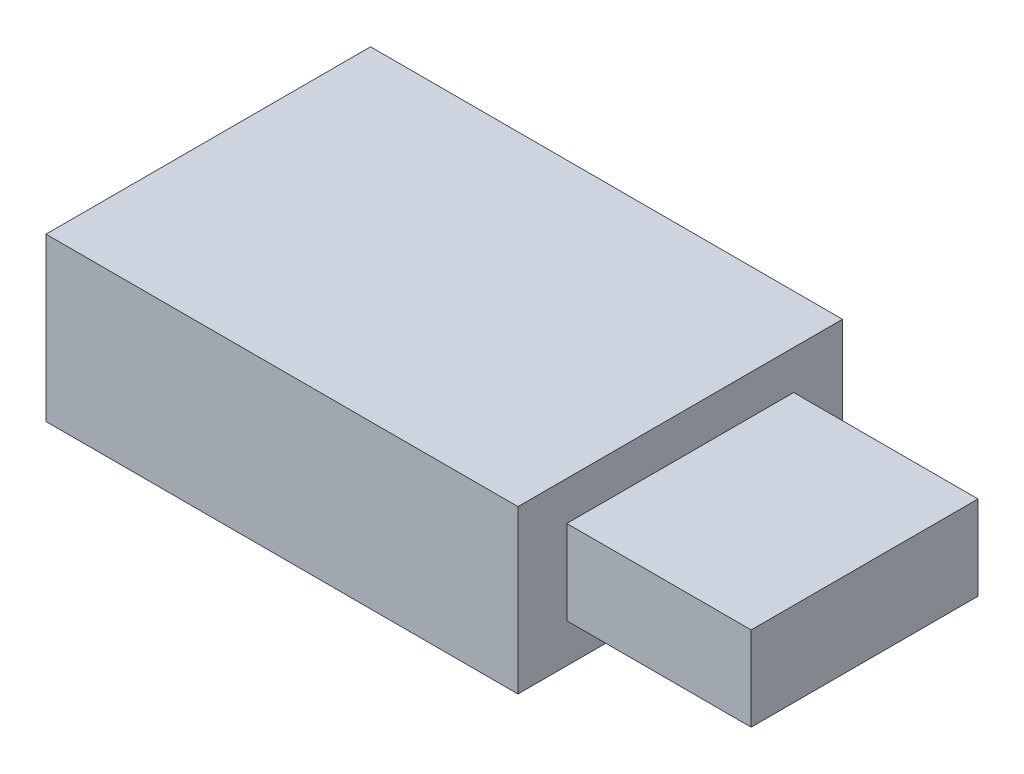
ISO-10303-21;
HEADER;
FILE_DESCRIPTION(('STEP AP214'),'2;1');
FILE_NAME('part.step','',(''),(''),'','','');
FILE_SCHEMA(('AUTOMOTIVE_DESIGN { 1 0 10303 214 1 1 1 1 }'));
ENDSEC;
DATA;
#1=APPLICATION_CONTEXT('core data for automotive mechanical design processes');
#2=APPLICATION_PROTOCOL_DEFINITION('international standard','automotive_design',2000,#1);
#3=PRODUCT_CONTEXT('',#1,'mechanical');
#4=PRODUCT('Part','Part','',(#3));
#5=PRODUCT_RELATED_PRODUCT_CATEGORY('part','',(#4));
#6=PRODUCT_DEFINITION_FORMATION('','',#4);
#7=PRODUCT_DEFINITION_CONTEXT('part definition',#1,'design');
#8=PRODUCT_DEFINITION('design','',#6,#7);
#9=PRODUCT_DEFINITION_SHAPE('','',#8);
#10=(LENGTH_UNIT() NAMED_UNIT(*) SI_UNIT(.MILLI.,.METRE.));
#11=(NAMED_UNIT(*) PLANE_ANGLE_UNIT() SI_UNIT($,.RADIAN.));
#12=(NAMED_UNIT(*) SI_UNIT($,.STERADIAN.) SOLID_ANGLE_UNIT());
#13=UNCERTAINTY_MEASURE_WITH_UNIT(LENGTH_MEASURE(1.E-05),#10,'distance_accuracy_value','');
#14=(GEOMETRIC_REPRESENTATION_CONTEXT(3) GLOBAL_UNCERTAINTY_ASSIGNED_CONTEXT((#13)) GLOBAL_UNIT_ASSIGNED_CONTEXT((#10,
#11,#12)) REPRESENTATION_CONTEXT('',''));
#15=CARTESIAN_POINT('',(0.,0.,0.));
#16=DIRECTION('',(0.,0.,1.));
#17=DIRECTION('',(1.,0.,0.));
#18=AXIS2_PLACEMENT_3D('',#15,#16,#17);
#19=CARTESIAN_POINT('',(12.4841,4.2926,8.5852));
#20=DIRECTION('',(-1.,0.,0.));
#21=DIRECTION('',(0.,0.,1.));
#22=AXIS2_PLACEMENT_3D('',#19,#20,#21);
#23=PLANE('',#22);
#24=DIRECTION('',(0.,0.,-1.));
#25=VECTOR('',#24,1.);
#26=CARTESIAN_POINT('',(12.4841,-4.2926,8.5852));
#27=LINE('',#26,#25);
#28=CARTESIAN_POINT('',(12.4841,-4.2926,8.5852));
#29=VERTEX_POINT('',#28);
#30=CARTESIAN_POINT('',(12.4841,-4.2926,-8.5852));
#31=VERTEX_POINT('',#30);
#32=EDGE_CURVE('E139',#29,#31,#27,.T.);
#33=ORIENTED_EDGE('',*,*,#32,.T.);
#34=DIRECTION('',(0.,-1.,0.));
#35=VECTOR('',#34,1.);
#36=CARTESIAN_POINT('',(12.4841,4.2926,-8.5852));
#37=LINE('',#36,#35);
#38=CARTESIAN_POINT('',(12.4841,4.2926,-8.5852));
#39=VERTEX_POINT('',#38);
#40=EDGE_CURVE('E144',#39,#31,#37,.T.);
#41=ORIENTED_EDGE('',*,*,#40,.F.);
#42=DIRECTION('',(0.,0.,-1.));
#43=VECTOR('',#42,1.);
#44=CARTESIAN_POINT('',(12.4841,4.2926,8.5852));
#45=LINE('',#44,#43);
#46=CARTESIAN_POINT('',(12.4841,4.2926,8.5852));
#47=VERTEX_POINT('',#46);
#48=EDGE_CURVE('E133',#47,#39,#45,.T.);
#49=ORIENTED_EDGE('',*,*,#48,.F.);
#50=DIRECTION('',(0.,-1.,0.));
#51=VECTOR('',#50,1.);
#52=CARTESIAN_POINT('',(12.4841,4.2926,8.5852));
#53=LINE('',#52,#51);
#54=EDGE_CURVE('E147',#47,#29,#53,.T.);
#55=ORIENTED_EDGE('',*,*,#54,.T.);
#56=EDGE_LOOP('',(#33,#41,#49,#55));
#57=FACE_BOUND('',#56,.T.);
#58=DIRECTION('',(0.,1.,0.));
#59=VECTOR('',#58,1.);
#60=CARTESIAN_POINT('',(12.4841,-2.22885,-6.00075));
#61=LINE('',#60,#59);
#62=CARTESIAN_POINT('',(12.4841,-2.22885,-6.00075));
#63=VERTEX_POINT('',#62);
#64=CARTESIAN_POINT('',(12.4841,2.22885,-6.00075));
#65=VERTEX_POINT('',#64);
#66=EDGE_CURVE('E48',#63,#65,#61,.T.);
#67=ORIENTED_EDGE('',*,*,#66,.F.);
#68=DIRECTION('',(0.,0.,-1.));
#69=VECTOR('',#68,1.);
#70=CARTESIAN_POINT('',(12.4841,-2.22885,6.00075));
#71=LINE('',#70,#69);
#72=CARTESIAN_POINT('',(12.4841,-2.22885,6.00075));
#73=VERTEX_POINT('',#72);
#74=EDGE_CURVE('E52',#73,#63,#71,.T.);
#75=ORIENTED_EDGE('',*,*,#74,.F.);
#76=DIRECTION('',(0.,-1.,0.));
#77=VECTOR('',#76,1.);
#78=CARTESIAN_POINT('',(12.4841,-2.22885,6.00075));
#79=LINE('',#78,#77);
#80=CARTESIAN_POINT('',(12.4841,2.22885,6.00075));
#81=VERTEX_POINT('',#80);
#82=EDGE_CURVE('E290',#81,#73,#79,.T.);
#83=ORIENTED_EDGE('',*,*,#82,.F.);
#84=DIRECTION('',(0.,0.,1.));
#85=VECTOR('',#84,1.);
#86=CARTESIAN_POINT('',(12.4841,2.22885,6.00075));
#87=LINE('',#86,#85);
#88=EDGE_CURVE('E283',#65,#81,#87,.T.);
#89=ORIENTED_EDGE('',*,*,#88,.F.);
#90=EDGE_LOOP('',(#67,#75,#83,#89));
#91=FACE_BOUND('',#90,.T.);
#92=ADVANCED_FACE('F33',(#57,#91),#23,.F.);
#93=CARTESIAN_POINT('',(-12.4841,4.2926,8.5852));
#94=DIRECTION('',(1.,0.,0.));
#95=DIRECTION('',(0.,0.,-1.));
#96=AXIS2_PLACEMENT_3D('',#93,#94,#95);
#97=PLANE('',#96);
#98=CARTESIAN_POINT('',(-12.4841,0.,0.));
#99=DIRECTION('',(1.,0.,0.));
#100=DIRECTION('',(0.,0.,-1.));
#101=AXIS2_PLACEMENT_3D('',#98,#99,#100);
#102=CIRCLE('',#101,1.27);
#103=CARTESIAN_POINT('',(-12.4841,0.,-1.27));
#104=VERTEX_POINT('',#103);
#105=EDGE_CURVE('E11',#104,#104,#102,.F.);
#106=ORIENTED_EDGE('',*,*,#105,.F.);
#107=EDGE_LOOP('',(#106));
#108=FACE_BOUND('',#107,.T.);
#109=DIRECTION('',(0.,0.,1.));
#110=VECTOR('',#109,1.);
#111=CARTESIAN_POINT('',(-12.4841,-4.2926,8.5852));
#112=LINE('',#111,#110);
#113=CARTESIAN_POINT('',(-12.4841,-4.2926,-8.5852));
#114=VERTEX_POINT('',#113);
#115=CARTESIAN_POINT('',(-12.4841,-4.2926,8.5852));
#116=VERTEX_POINT('',#115);
#117=EDGE_CURVE('E118',#114,#116,#112,.T.);
#118=ORIENTED_EDGE('',*,*,#117,.T.);
#119=DIRECTION('',(0.,-1.,0.));
#120=VECTOR('',#119,1.);
#121=CARTESIAN_POINT('',(-12.4841,4.2926,8.5852));
#122=LINE('',#121,#120);
#123=CARTESIAN_POINT('',(-12.4841,4.2926,8.5852));
#124=VERTEX_POINT('',#123);
#125=EDGE_CURVE('E41',#124,#116,#122,.T.);
#126=ORIENTED_EDGE('',*,*,#125,.F.);
#127=DIRECTION('',(0.,0.,1.));
#128=VECTOR('',#127,1.);
#129=CARTESIAN_POINT('',(-12.4841,4.2926,8.5852));
#130=LINE('',#129,#128);
#131=CARTESIAN_POINT('',(-12.4841,4.2926,-8.5852));
#132=VERTEX_POINT('',#131);
#133=EDGE_CURVE('E127',#132,#124,#130,.T.);
#134=ORIENTED_EDGE('',*,*,#133,.F.);
#135=DIRECTION('',(0.,-1.,0.));
#136=VECTOR('',#135,1.);
#137=CARTESIAN_POINT('',(-12.4841,4.2926,-8.5852));
#138=LINE('',#137,#136);
#139=EDGE_CURVE('E136',#132,#114,#138,.T.);
#140=ORIENTED_EDGE('',*,*,#139,.T.);
#141=EDGE_LOOP('',(#118,#126,#134,#140));
#142=FACE_BOUND('',#141,.T.);
#143=ADVANCED_FACE('F35',(#108,#142),#97,.F.);
#144=CARTESIAN_POINT('',(-12.4841,4.2926,8.5852));
#145=DIRECTION('',(0.,0.,-1.));
#146=DIRECTION('',(-1.,0.,0.));
#147=AXIS2_PLACEMENT_3D('',#144,#145,#146);
#148=PLANE('',#147);
#149=DIRECTION('',(1.,0.,0.));
#150=VECTOR('',#149,1.);
#151=CARTESIAN_POINT('',(-12.4841,-4.2926,8.5852));
#152=LINE('',#151,#150);
#153=EDGE_CURVE('E121',#116,#29,#152,.T.);
#154=ORIENTED_EDGE('',*,*,#153,.T.);
#155=ORIENTED_EDGE('',*,*,#54,.F.);
#156=DIRECTION('',(1.,0.,0.));
#157=VECTOR('',#156,1.);
#158=CARTESIAN_POINT('',(-12.4841,4.2926,8.5852));
#159=LINE('',#158,#157);
#160=EDGE_CURVE('E130',#124,#47,#159,.T.);
#161=ORIENTED_EDGE('',*,*,#160,.F.);
#162=ORIENTED_EDGE('',*,*,#125,.T.);
#163=EDGE_LOOP('',(#154,#155,#161,#162));
#164=FACE_BOUND('',#163,.T.);
#165=ADVANCED_FACE('F152',(#164),#148,.F.);
#166=CARTESIAN_POINT('',(-12.4841,4.2926,-8.5852));
#167=DIRECTION('',(0.,0.,1.));
#168=DIRECTION('',(1.,0.,0.));
#169=AXIS2_PLACEMENT_3D('',#166,#167,#168);
#170=PLANE('',#169);
#171=DIRECTION('',(-1.,0.,0.));
#172=VECTOR('',#171,1.);
#173=CARTESIAN_POINT('',(-12.4841,-4.2926,-8.5852));
#174=LINE('',#173,#172);
#175=EDGE_CURVE('E131',#31,#114,#174,.T.);
#176=ORIENTED_EDGE('',*,*,#175,.T.);
#177=ORIENTED_EDGE('',*,*,#139,.F.);
#178=DIRECTION('',(-1.,0.,0.));
#179=VECTOR('',#178,1.);
#180=CARTESIAN_POINT('',(-12.4841,4.2926,-8.5852));
#181=LINE('',#180,#179);
#182=EDGE_CURVE('E135',#39,#132,#181,.T.);
#183=ORIENTED_EDGE('',*,*,#182,.F.);
#184=ORIENTED_EDGE('',*,*,#40,.T.);
#185=EDGE_LOOP('',(#176,#177,#183,#184));
#186=FACE_BOUND('',#185,.T.);
#187=ADVANCED_FACE('F167',(#186),#170,.F.);
#188=CARTESIAN_POINT('',(0.,4.2926,0.));
#189=DIRECTION('',(0.,-1.,0.));
#190=DIRECTION('',(0.,0.,-1.));
#191=AXIS2_PLACEMENT_3D('',#188,#189,#190);
#192=PLANE('',#191);
#193=ORIENTED_EDGE('',*,*,#133,.T.);
#194=ORIENTED_EDGE('',*,*,#160,.T.);
#195=ORIENTED_EDGE('',*,*,#48,.T.);
#196=ORIENTED_EDGE('',*,*,#182,.T.);
#197=EDGE_LOOP('',(#193,#194,#195,#196));
#198=FACE_BOUND('',#197,.T.);
#199=ADVANCED_FACE('F169',(#198),#192,.F.);
#200=CARTESIAN_POINT('',(0.,-4.2926,0.));
#201=DIRECTION('',(0.,-1.,0.));
#202=DIRECTION('',(0.,0.,-1.));
#203=AXIS2_PLACEMENT_3D('',#200,#201,#202);
#204=PLANE('',#203);
#205=ORIENTED_EDGE('',*,*,#117,.F.);
#206=ORIENTED_EDGE('',*,*,#175,.F.);
#207=ORIENTED_EDGE('',*,*,#32,.F.);
#208=ORIENTED_EDGE('',*,*,#153,.F.);
#209=EDGE_LOOP('',(#205,#206,#207,#208));
#210=FACE_BOUND('',#209,.T.);
#211=ADVANCED_FACE('F160',(#210),#204,.T.);
#212=CARTESIAN_POINT('',(22.2377,-2.22885,-6.00075));
#213=DIRECTION('',(0.,0.,1.));
#214=DIRECTION('',(1.,0.,0.));
#215=AXIS2_PLACEMENT_3D('',#212,#213,#214);
#216=PLANE('',#215);
#217=ORIENTED_EDGE('',*,*,#66,.T.);
#218=DIRECTION('',(-1.,0.,0.));
#219=VECTOR('',#218,1.);
#220=CARTESIAN_POINT('',(22.2377,2.22885,-6.00075));
#221=LINE('',#220,#219);
#222=CARTESIAN_POINT('',(22.2377,2.22885,-6.00075));
#223=VERTEX_POINT('',#222);
#224=EDGE_CURVE('E101',#223,#65,#221,.T.);
#225=ORIENTED_EDGE('',*,*,#224,.F.);
#226=DIRECTION('',(0.,1.,0.));
#227=VECTOR('',#226,1.);
#228=CARTESIAN_POINT('',(22.2377,-2.22885,-6.00075));
#229=LINE('',#228,#227);
#230=CARTESIAN_POINT('',(22.2377,-2.22885,-6.00075));
#231=VERTEX_POINT('',#230);
#232=EDGE_CURVE('E107',#231,#223,#229,.T.);
#233=ORIENTED_EDGE('',*,*,#232,.F.);
#234=DIRECTION('',(-1.,0.,0.));
#235=VECTOR('',#234,1.);
#236=CARTESIAN_POINT('',(22.2377,-2.22885,-6.00075));
#237=LINE('',#236,#235);
#238=EDGE_CURVE('E287',#231,#63,#237,.T.);
#239=ORIENTED_EDGE('',*,*,#238,.T.);
#240=EDGE_LOOP('',(#217,#225,#233,#239));
#241=FACE_BOUND('',#240,.T.);
#242=ADVANCED_FACE('F117',(#241),#216,.F.);
#243=CARTESIAN_POINT('',(22.2377,2.22885,6.00075));
#244=DIRECTION('',(0.,-1.,0.));
#245=DIRECTION('',(0.,0.,-1.));
#246=AXIS2_PLACEMENT_3D('',#243,#244,#245);
#247=PLANE('',#246);
#248=ORIENTED_EDGE('',*,*,#88,.T.);
#249=DIRECTION('',(-1.,0.,0.));
#250=VECTOR('',#249,1.);
#251=CARTESIAN_POINT('',(22.2377,2.22885,6.00075));
#252=LINE('',#251,#250);
#253=CARTESIAN_POINT('',(22.2377,2.22885,6.00075));
#254=VERTEX_POINT('',#253);
#255=EDGE_CURVE('E103',#254,#81,#252,.T.);
#256=ORIENTED_EDGE('',*,*,#255,.F.);
#257=DIRECTION('',(0.,0.,1.));
#258=VECTOR('',#257,1.);
#259=CARTESIAN_POINT('',(22.2377,2.22885,6.00075));
#260=LINE('',#259,#258);
#261=EDGE_CURVE('E96',#223,#254,#260,.T.);
#262=ORIENTED_EDGE('',*,*,#261,.F.);
#263=ORIENTED_EDGE('',*,*,#224,.T.);
#264=EDGE_LOOP('',(#248,#256,#262,#263));
#265=FACE_BOUND('',#264,.T.);
#266=ADVANCED_FACE('F99',(#265),#247,.F.);
#267=CARTESIAN_POINT('',(22.2377,-2.22885,6.00075));
#268=DIRECTION('',(0.,0.,-1.));
#269=DIRECTION('',(-1.,0.,0.));
#270=AXIS2_PLACEMENT_3D('',#267,#268,#269);
#271=PLANE('',#270);
#272=ORIENTED_EDGE('',*,*,#82,.T.);
#273=DIRECTION('',(-1.,0.,0.));
#274=VECTOR('',#273,1.);
#275=CARTESIAN_POINT('',(22.2377,-2.22885,6.00075));
#276=LINE('',#275,#274);
#277=CARTESIAN_POINT('',(22.2377,-2.22885,6.00075));
#278=VERTEX_POINT('',#277);
#279=EDGE_CURVE('E123',#278,#73,#276,.T.);
#280=ORIENTED_EDGE('',*,*,#279,.F.);
#281=DIRECTION('',(0.,-1.,0.));
#282=VECTOR('',#281,1.);
#283=CARTESIAN_POINT('',(22.2377,-2.22885,6.00075));
#284=LINE('',#283,#282);
#285=EDGE_CURVE('E106',#254,#278,#284,.T.);
#286=ORIENTED_EDGE('',*,*,#285,.F.);
#287=ORIENTED_EDGE('',*,*,#255,.T.);
#288=EDGE_LOOP('',(#272,#280,#286,#287));
#289=FACE_BOUND('',#288,.T.);
#290=ADVANCED_FACE('F224',(#289),#271,.F.);
#291=CARTESIAN_POINT('',(22.2377,-2.22885,6.00075));
#292=DIRECTION('',(0.,1.,0.));
#293=DIRECTION('',(0.,0.,1.));
#294=AXIS2_PLACEMENT_3D('',#291,#292,#293);
#295=PLANE('',#294);
#296=ORIENTED_EDGE('',*,*,#74,.T.);
#297=ORIENTED_EDGE('',*,*,#238,.F.);
#298=DIRECTION('',(0.,0.,-1.));
#299=VECTOR('',#298,1.);
#300=CARTESIAN_POINT('',(22.2377,-2.22885,6.00075));
#301=LINE('',#300,#299);
#302=EDGE_CURVE('E112',#278,#231,#301,.T.);
#303=ORIENTED_EDGE('',*,*,#302,.F.);
#304=ORIENTED_EDGE('',*,*,#279,.T.);
#305=EDGE_LOOP('',(#296,#297,#303,#304));
#306=FACE_BOUND('',#305,.T.);
#307=ADVANCED_FACE('F233',(#306),#295,.F.);
#308=CARTESIAN_POINT('',(22.2377,0.,0.));
#309=DIRECTION('',(-1.,0.,0.));
#310=DIRECTION('',(0.,0.,1.));
#311=AXIS2_PLACEMENT_3D('',#308,#309,#310);
#312=PLANE('',#311);
#313=ORIENTED_EDGE('',*,*,#232,.T.);
#314=ORIENTED_EDGE('',*,*,#261,.T.);
#315=ORIENTED_EDGE('',*,*,#285,.T.);
#316=ORIENTED_EDGE('',*,*,#302,.T.);
#317=EDGE_LOOP('',(#313,#314,#315,#316));
#318=FACE_BOUND('',#317,.T.);
#319=ADVANCED_FACE('F110',(#318),#312,.F.);
#320=CARTESIAN_POINT('',(-15.0241,0.,0.));
#321=DIRECTION('',(1.,0.,0.));
#322=DIRECTION('',(0.,0.,-1.));
#323=AXIS2_PLACEMENT_3D('',#320,#321,#322);
#324=CYLINDRICAL_SURFACE('',#323,1.27);
#325=CARTESIAN_POINT('',(-15.0241,0.,0.));
#326=DIRECTION('',(-1.,0.,0.));
#327=DIRECTION('',(0.,0.,1.));
#328=AXIS2_PLACEMENT_3D('',#325,#326,#327);
#329=CIRCLE('',#328,1.27);
#330=CARTESIAN_POINT('',(-15.0241,0.,1.27));
#331=VERTEX_POINT('',#330);
#332=EDGE_CURVE('E281',#331,#331,#329,.T.);
#333=ORIENTED_EDGE('',*,*,#332,.F.);
#334=EDGE_LOOP('',(#333));
#335=FACE_BOUND('',#334,.T.);
#336=ORIENTED_EDGE('',*,*,#105,.T.);
#337=EDGE_LOOP('',(#336));
#338=FACE_BOUND('',#337,.T.);
#339=ADVANCED_FACE('F251',(#335,#338),#324,.T.);
#340=CARTESIAN_POINT('',(-15.0241,0.,0.));
#341=DIRECTION('',(-1.,0.,0.));
#342=DIRECTION('',(0.,0.,1.));
#343=AXIS2_PLACEMENT_3D('',#340,#341,#342);
#344=PLANE('',#343);
#345=ORIENTED_EDGE('',*,*,#332,.T.);
#346=EDGE_LOOP('',(#345));
#347=FACE_BOUND('',#346,.T.);
#348=ADVANCED_FACE('F265',(#347),#344,.T.);
#349=CLOSED_SHELL('',(#92,#143,#165,#187,#199,#211,#242,#266,#290,#307,#319,#339,#348));
#350=MANIFOLD_SOLID_BREP('B2',#349);
#351=ADVANCED_BREP_SHAPE_REPRESENTATION('',(#18,#350),#14);
#352=SHAPE_DEFINITION_REPRESENTATION(#9,#351);
ENDSEC;
END-ISO-10303-21;
